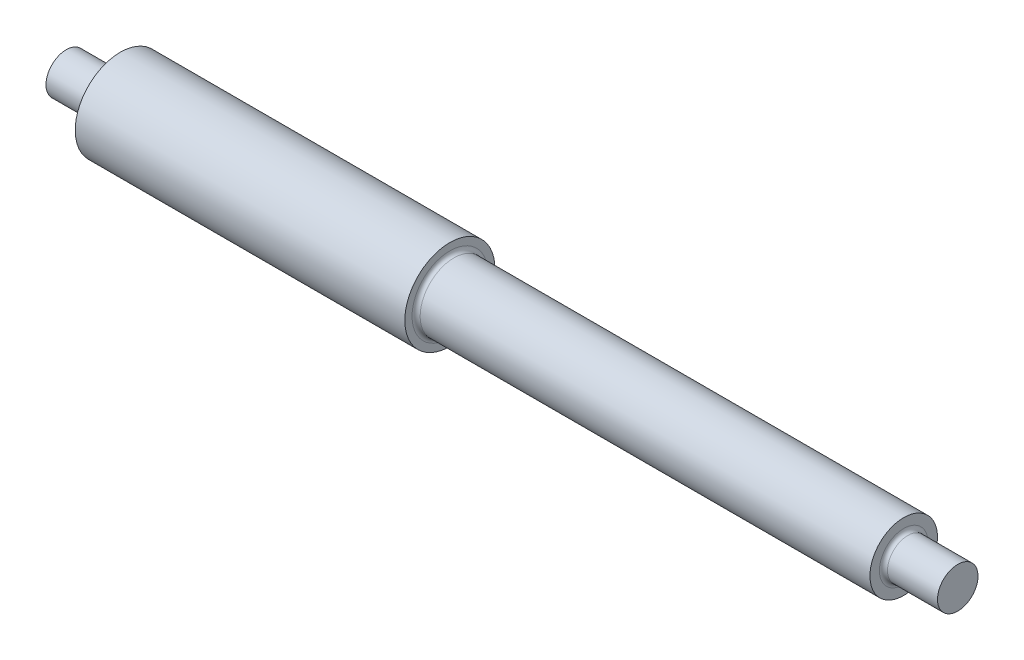
ISO-10303-21;
HEADER;
FILE_DESCRIPTION(('STEP AP214'),'2;1');
FILE_NAME('part.step','',(''),(''),'','','');
FILE_SCHEMA(('AUTOMOTIVE_DESIGN { 1 0 10303 214 1 1 1 1 }'));
ENDSEC;
DATA;
#1=APPLICATION_CONTEXT('core data for automotive mechanical design processes');
#2=APPLICATION_PROTOCOL_DEFINITION('international standard','automotive_design',2000,#1);
#3=PRODUCT_CONTEXT('',#1,'mechanical');
#4=PRODUCT('Part','Part','',(#3));
#5=PRODUCT_RELATED_PRODUCT_CATEGORY('part','',(#4));
#6=PRODUCT_DEFINITION_FORMATION('','',#4);
#7=PRODUCT_DEFINITION_CONTEXT('part definition',#1,'design');
#8=PRODUCT_DEFINITION('design','',#6,#7);
#9=PRODUCT_DEFINITION_SHAPE('','',#8);
#10=(LENGTH_UNIT() NAMED_UNIT(*) SI_UNIT(.MILLI.,.METRE.));
#11=(NAMED_UNIT(*) PLANE_ANGLE_UNIT() SI_UNIT($,.RADIAN.));
#12=(NAMED_UNIT(*) SI_UNIT($,.STERADIAN.) SOLID_ANGLE_UNIT());
#13=UNCERTAINTY_MEASURE_WITH_UNIT(LENGTH_MEASURE(1.E-05),#10,'distance_accuracy_value','');
#14=(GEOMETRIC_REPRESENTATION_CONTEXT(3) GLOBAL_UNCERTAINTY_ASSIGNED_CONTEXT((#13)) GLOBAL_UNIT_ASSIGNED_CONTEXT((#10,
#11,#12)) REPRESENTATION_CONTEXT('',''));
#15=CARTESIAN_POINT('',(0.,0.,0.));
#16=DIRECTION('',(0.,0.,1.));
#17=DIRECTION('',(1.,0.,0.));
#18=AXIS2_PLACEMENT_3D('',#15,#16,#17);
#19=CARTESIAN_POINT('',(0.,0.,0.));
#20=DIRECTION('',(-1.,0.,0.));
#21=DIRECTION('',(0.,-1.,0.));
#22=AXIS2_PLACEMENT_3D('',#19,#20,#21);
#23=PLANE('',#22);
#24=CARTESIAN_POINT('',(0.,0.,0.));
#25=DIRECTION('',(1.,0.,0.));
#26=DIRECTION('',(0.,1.,0.));
#27=AXIS2_PLACEMENT_3D('',#24,#25,#26);
#28=CIRCLE('',#27,7.5);
#29=CARTESIAN_POINT('',(0.,7.5,0.));
#30=VERTEX_POINT('',#29);
#31=EDGE_CURVE('E10',#30,#30,#28,.T.);
#32=ORIENTED_EDGE('',*,*,#31,.F.);
#33=EDGE_LOOP('',(#32));
#34=FACE_BOUND('',#33,.T.);
#35=ADVANCED_FACE('F36',(#34),#23,.T.);
#36=CARTESIAN_POINT('',(330.,0.,0.));
#37=DIRECTION('',(1.,0.,0.));
#38=DIRECTION('',(0.,1.,0.));
#39=AXIS2_PLACEMENT_3D('',#36,#37,#38);
#40=CYLINDRICAL_SURFACE('',#39,7.5);
#41=ORIENTED_EDGE('',*,*,#31,.T.);
#42=EDGE_LOOP('',(#41));
#43=FACE_BOUND('',#42,.T.);
#44=CARTESIAN_POINT('',(18.5,0.,0.));
#45=DIRECTION('',(1.,0.,0.));
#46=DIRECTION('',(0.,1.,0.));
#47=AXIS2_PLACEMENT_3D('',#44,#45,#46);
#48=CIRCLE('',#47,7.5);
#49=CARTESIAN_POINT('',(18.5,7.5,0.));
#50=VERTEX_POINT('',#49);
#51=EDGE_CURVE('E42',#50,#50,#48,.T.);
#52=ORIENTED_EDGE('',*,*,#51,.F.);
#53=EDGE_LOOP('',(#52));
#54=FACE_BOUND('',#53,.T.);
#55=ADVANCED_FACE('F93',(#43,#54),#40,.T.);
#56=CARTESIAN_POINT('',(18.5,0.,0.));
#57=DIRECTION('',(1.,0.,0.));
#58=DIRECTION('',(0.,1.,0.));
#59=AXIS2_PLACEMENT_3D('',#56,#57,#58);
#60=TOROIDAL_SURFACE('',#59,9.,1.5);
#61=ORIENTED_EDGE('',*,*,#51,.T.);
#62=EDGE_LOOP('',(#61));
#63=FACE_BOUND('',#62,.T.);
#64=CARTESIAN_POINT('',(20.,0.,0.));
#65=DIRECTION('',(1.,0.,0.));
#66=DIRECTION('',(0.,1.,0.));
#67=AXIS2_PLACEMENT_3D('',#64,#65,#66);
#68=CIRCLE('',#67,9.);
#69=CARTESIAN_POINT('',(20.,9.,0.));
#70=VERTEX_POINT('',#69);
#71=EDGE_CURVE('E46',#70,#70,#68,.T.);
#72=ORIENTED_EDGE('',*,*,#71,.F.);
#73=EDGE_LOOP('',(#72));
#74=FACE_BOUND('',#73,.T.);
#75=ADVANCED_FACE('F98',(#63,#74),#60,.F.);
#76=CARTESIAN_POINT('',(20.,9.,0.));
#77=DIRECTION('',(-1.,0.,0.));
#78=DIRECTION('',(0.,-1.,0.));
#79=AXIS2_PLACEMENT_3D('',#76,#77,#78);
#80=PLANE('',#79);
#81=ORIENTED_EDGE('',*,*,#71,.T.);
#82=EDGE_LOOP('',(#81));
#83=FACE_BOUND('',#82,.T.);
#84=CARTESIAN_POINT('',(20.,0.,0.));
#85=DIRECTION('',(1.,0.,0.));
#86=DIRECTION('',(0.,1.,0.));
#87=AXIS2_PLACEMENT_3D('',#84,#85,#86);
#88=CIRCLE('',#87,16.675);
#89=CARTESIAN_POINT('',(20.,16.675,0.));
#90=VERTEX_POINT('',#89);
#91=EDGE_CURVE('E50',#90,#90,#88,.T.);
#92=ORIENTED_EDGE('',*,*,#91,.F.);
#93=EDGE_LOOP('',(#92));
#94=FACE_BOUND('',#93,.T.);
#95=ADVANCED_FACE('F102',(#83,#94),#80,.T.);
#96=CARTESIAN_POINT('',(330.,0.,0.));
#97=DIRECTION('',(1.,0.,0.));
#98=DIRECTION('',(0.,1.,0.));
#99=AXIS2_PLACEMENT_3D('',#96,#97,#98);
#100=CYLINDRICAL_SURFACE('',#99,16.675);
#101=ORIENTED_EDGE('',*,*,#91,.T.);
#102=EDGE_LOOP('',(#101));
#103=FACE_BOUND('',#102,.T.);
#104=CARTESIAN_POINT('',(142.,0.,0.));
#105=DIRECTION('',(1.,0.,0.));
#106=DIRECTION('',(0.,1.,0.));
#107=AXIS2_PLACEMENT_3D('',#104,#105,#106);
#108=CIRCLE('',#107,16.675);
#109=CARTESIAN_POINT('',(142.,16.675,0.));
#110=VERTEX_POINT('',#109);
#111=EDGE_CURVE('E55',#110,#110,#108,.T.);
#112=ORIENTED_EDGE('',*,*,#111,.F.);
#113=EDGE_LOOP('',(#112));
#114=FACE_BOUND('',#113,.T.);
#115=ADVANCED_FACE('F108',(#103,#114),#100,.T.);
#116=CARTESIAN_POINT('',(142.,16.675,0.));
#117=DIRECTION('',(1.,0.,0.));
#118=DIRECTION('',(0.,1.,0.));
#119=AXIS2_PLACEMENT_3D('',#116,#117,#118);
#120=PLANE('',#119);
#121=ORIENTED_EDGE('',*,*,#111,.T.);
#122=EDGE_LOOP('',(#121));
#123=FACE_BOUND('',#122,.T.);
#124=CARTESIAN_POINT('',(142.,0.,0.));
#125=DIRECTION('',(1.,0.,0.));
#126=DIRECTION('',(0.,1.,0.));
#127=AXIS2_PLACEMENT_3D('',#124,#125,#126);
#128=CIRCLE('',#127,14.);
#129=CARTESIAN_POINT('',(142.,14.,0.));
#130=VERTEX_POINT('',#129);
#131=EDGE_CURVE('E58',#130,#130,#128,.T.);
#132=ORIENTED_EDGE('',*,*,#131,.F.);
#133=EDGE_LOOP('',(#132));
#134=FACE_BOUND('',#133,.T.);
#135=ADVANCED_FACE('F112',(#123,#134),#120,.T.);
#136=CARTESIAN_POINT('',(143.5,0.,0.));
#137=DIRECTION('',(1.,0.,0.));
#138=DIRECTION('',(0.,1.,0.));
#139=AXIS2_PLACEMENT_3D('',#136,#137,#138);
#140=TOROIDAL_SURFACE('',#139,14.,1.5);
#141=ORIENTED_EDGE('',*,*,#131,.T.);
#142=EDGE_LOOP('',(#141));
#143=FACE_BOUND('',#142,.T.);
#144=CARTESIAN_POINT('',(143.5,0.,0.));
#145=DIRECTION('',(1.,0.,0.));
#146=DIRECTION('',(0.,1.,0.));
#147=AXIS2_PLACEMENT_3D('',#144,#145,#146);
#148=CIRCLE('',#147,12.5);
#149=CARTESIAN_POINT('',(143.5,12.5,0.));
#150=VERTEX_POINT('',#149);
#151=EDGE_CURVE('E61',#150,#150,#148,.T.);
#152=ORIENTED_EDGE('',*,*,#151,.F.);
#153=EDGE_LOOP('',(#152));
#154=FACE_BOUND('',#153,.T.);
#155=ADVANCED_FACE('F116',(#143,#154),#140,.F.);
#156=CARTESIAN_POINT('',(330.,0.,0.));
#157=DIRECTION('',(1.,0.,0.));
#158=DIRECTION('',(0.,1.,0.));
#159=AXIS2_PLACEMENT_3D('',#156,#157,#158);
#160=CYLINDRICAL_SURFACE('',#159,12.5);
#161=ORIENTED_EDGE('',*,*,#151,.T.);
#162=EDGE_LOOP('',(#161));
#163=FACE_BOUND('',#162,.T.);
#164=CARTESIAN_POINT('',(310.,0.,0.));
#165=DIRECTION('',(1.,0.,0.));
#166=DIRECTION('',(0.,1.,0.));
#167=AXIS2_PLACEMENT_3D('',#164,#165,#166);
#168=CIRCLE('',#167,12.5);
#169=CARTESIAN_POINT('',(310.,12.5,0.));
#170=VERTEX_POINT('',#169);
#171=EDGE_CURVE('E64',#170,#170,#168,.T.);
#172=ORIENTED_EDGE('',*,*,#171,.F.);
#173=EDGE_LOOP('',(#172));
#174=FACE_BOUND('',#173,.T.);
#175=ADVANCED_FACE('F120',(#163,#174),#160,.T.);
#176=CARTESIAN_POINT('',(310.,12.5,0.));
#177=DIRECTION('',(1.,0.,0.));
#178=DIRECTION('',(0.,1.,0.));
#179=AXIS2_PLACEMENT_3D('',#176,#177,#178);
#180=PLANE('',#179);
#181=ORIENTED_EDGE('',*,*,#171,.T.);
#182=EDGE_LOOP('',(#181));
#183=FACE_BOUND('',#182,.T.);
#184=CARTESIAN_POINT('',(310.,0.,0.));
#185=DIRECTION('',(1.,0.,0.));
#186=DIRECTION('',(0.,1.,0.));
#187=AXIS2_PLACEMENT_3D('',#184,#185,#186);
#188=CIRCLE('',#187,8.99999999999999);
#189=CARTESIAN_POINT('',(310.,9.,0.));
#190=VERTEX_POINT('',#189);
#191=EDGE_CURVE('E67',#190,#190,#188,.T.);
#192=ORIENTED_EDGE('',*,*,#191,.F.);
#193=EDGE_LOOP('',(#192));
#194=FACE_BOUND('',#193,.T.);
#195=ADVANCED_FACE('F89',(#183,#194),#180,.T.);
#196=CARTESIAN_POINT('',(311.5,0.,0.));
#197=DIRECTION('',(1.,0.,0.));
#198=DIRECTION('',(0.,1.,0.));
#199=AXIS2_PLACEMENT_3D('',#196,#197,#198);
#200=TOROIDAL_SURFACE('',#199,8.99999999999999,1.5);
#201=ORIENTED_EDGE('',*,*,#191,.T.);
#202=EDGE_LOOP('',(#201));
#203=FACE_BOUND('',#202,.T.);
#204=CARTESIAN_POINT('',(311.5,0.,0.));
#205=DIRECTION('',(1.,0.,0.));
#206=DIRECTION('',(0.,1.,0.));
#207=AXIS2_PLACEMENT_3D('',#204,#205,#206);
#208=CIRCLE('',#207,7.49999999999999);
#209=CARTESIAN_POINT('',(311.5,7.5,0.));
#210=VERTEX_POINT('',#209);
#211=EDGE_CURVE('E70',#210,#210,#208,.T.);
#212=ORIENTED_EDGE('',*,*,#211,.F.);
#213=EDGE_LOOP('',(#212));
#214=FACE_BOUND('',#213,.T.);
#215=ADVANCED_FACE('F81',(#203,#214),#200,.F.);
#216=CARTESIAN_POINT('',(330.,0.,0.));
#217=DIRECTION('',(1.,0.,0.));
#218=DIRECTION('',(0.,1.,0.));
#219=AXIS2_PLACEMENT_3D('',#216,#217,#218);
#220=CYLINDRICAL_SURFACE('',#219,7.49999999999999);
#221=ORIENTED_EDGE('',*,*,#211,.T.);
#222=EDGE_LOOP('',(#221));
#223=FACE_BOUND('',#222,.T.);
#224=CARTESIAN_POINT('',(330.,0.,0.));
#225=DIRECTION('',(1.,0.,0.));
#226=DIRECTION('',(0.,1.,0.));
#227=AXIS2_PLACEMENT_3D('',#224,#225,#226);
#228=CIRCLE('',#227,7.49999999999999);
#229=CARTESIAN_POINT('',(330.,7.5,0.));
#230=VERTEX_POINT('',#229);
#231=EDGE_CURVE('E73',#230,#230,#228,.T.);
#232=ORIENTED_EDGE('',*,*,#231,.F.);
#233=EDGE_LOOP('',(#232));
#234=FACE_BOUND('',#233,.T.);
#235=ADVANCED_FACE('F79',(#223,#234),#220,.T.);
#236=CARTESIAN_POINT('',(330.,7.5,0.));
#237=DIRECTION('',(1.,0.,0.));
#238=DIRECTION('',(0.,1.,0.));
#239=AXIS2_PLACEMENT_3D('',#236,#237,#238);
#240=PLANE('',#239);
#241=ORIENTED_EDGE('',*,*,#231,.T.);
#242=EDGE_LOOP('',(#241));
#243=FACE_BOUND('',#242,.T.);
#244=ADVANCED_FACE('F77',(#243),#240,.T.);
#245=CLOSED_SHELL('',(#35,#55,#75,#95,#115,#135,#155,#175,#195,#215,#235,#244));
#246=MANIFOLD_SOLID_BREP('B2',#245);
#247=ADVANCED_BREP_SHAPE_REPRESENTATION('',(#18,#246),#14);
#248=SHAPE_DEFINITION_REPRESENTATION(#9,#247);
ENDSEC;
END-ISO-10303-21;
